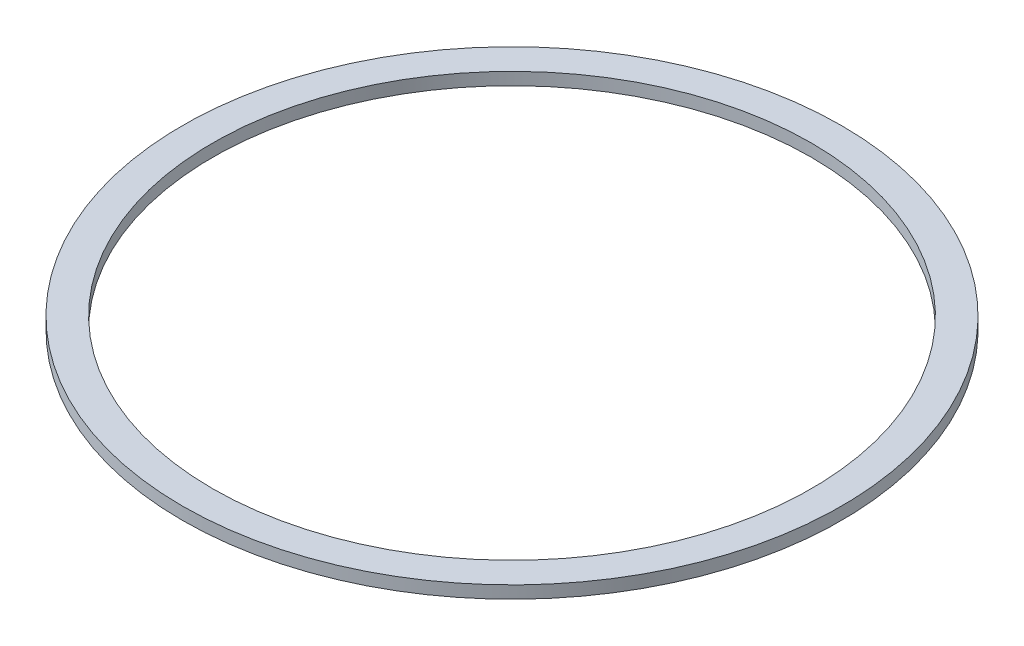
ISO-10303-21;
HEADER;
FILE_DESCRIPTION(('STEP AP214'),'2;1');
FILE_NAME('part.step','',(''),(''),'','','');
FILE_SCHEMA(('AUTOMOTIVE_DESIGN { 1 0 10303 214 1 1 1 1 }'));
ENDSEC;
DATA;
#1=APPLICATION_CONTEXT('core data for automotive mechanical design processes');
#2=APPLICATION_PROTOCOL_DEFINITION('international standard','automotive_design',2000,#1);
#3=PRODUCT_CONTEXT('',#1,'mechanical');
#4=PRODUCT('Part','Part','',(#3));
#5=PRODUCT_RELATED_PRODUCT_CATEGORY('part','',(#4));
#6=PRODUCT_DEFINITION_FORMATION('','',#4);
#7=PRODUCT_DEFINITION_CONTEXT('part definition',#1,'design');
#8=PRODUCT_DEFINITION('design','',#6,#7);
#9=PRODUCT_DEFINITION_SHAPE('','',#8);
#10=(LENGTH_UNIT() NAMED_UNIT(*) SI_UNIT(.MILLI.,.METRE.));
#11=(NAMED_UNIT(*) PLANE_ANGLE_UNIT() SI_UNIT($,.RADIAN.));
#12=(NAMED_UNIT(*) SI_UNIT($,.STERADIAN.) SOLID_ANGLE_UNIT());
#13=UNCERTAINTY_MEASURE_WITH_UNIT(LENGTH_MEASURE(1.E-05),#10,'distance_accuracy_value','');
#14=(GEOMETRIC_REPRESENTATION_CONTEXT(3) GLOBAL_UNCERTAINTY_ASSIGNED_CONTEXT((#13)) GLOBAL_UNIT_ASSIGNED_CONTEXT((#10,
#11,#12)) REPRESENTATION_CONTEXT('',''));
#15=CARTESIAN_POINT('',(0.,0.,0.));
#16=DIRECTION('',(0.,0.,1.));
#17=DIRECTION('',(1.,0.,0.));
#18=AXIS2_PLACEMENT_3D('',#15,#16,#17);
#19=CARTESIAN_POINT('',(0.,2.,0.));
#20=DIRECTION('',(0.,1.,0.));
#21=DIRECTION('',(0.,0.,1.));
#22=AXIS2_PLACEMENT_3D('',#19,#20,#21);
#23=PLANE('',#22);
#24=CARTESIAN_POINT('',(0.,2.,0.));
#25=DIRECTION('',(0.,1.,0.));
#26=DIRECTION('',(0.,0.,1.));
#27=AXIS2_PLACEMENT_3D('',#24,#25,#26);
#28=CIRCLE('',#27,53.);
#29=CARTESIAN_POINT('',(0.,2.,53.));
#30=VERTEX_POINT('',#29);
#31=EDGE_CURVE('E10',#30,#30,#28,.T.);
#32=ORIENTED_EDGE('',*,*,#31,.T.);
#33=EDGE_LOOP('',(#32));
#34=FACE_BOUND('',#33,.T.);
#35=CARTESIAN_POINT('',(0.,2.,0.));
#36=DIRECTION('',(0.,1.,0.));
#37=DIRECTION('',(0.,0.,1.));
#38=AXIS2_PLACEMENT_3D('',#35,#36,#37);
#39=CIRCLE('',#38,48.15);
#40=CARTESIAN_POINT('',(0.,2.,48.15));
#41=VERTEX_POINT('',#40);
#42=EDGE_CURVE('E50',#41,#41,#39,.T.);
#43=ORIENTED_EDGE('',*,*,#42,.F.);
#44=EDGE_LOOP('',(#43));
#45=FACE_BOUND('',#44,.T.);
#46=ADVANCED_FACE('F37',(#34,#45),#23,.T.);
#47=CARTESIAN_POINT('',(0.,0.,0.));
#48=DIRECTION('',(0.,1.,0.));
#49=DIRECTION('',(0.,0.,1.));
#50=AXIS2_PLACEMENT_3D('',#47,#48,#49);
#51=PLANE('',#50);
#52=CARTESIAN_POINT('',(0.,0.,0.));
#53=DIRECTION('',(0.,1.,0.));
#54=DIRECTION('',(0.,0.,1.));
#55=AXIS2_PLACEMENT_3D('',#52,#53,#54);
#56=CIRCLE('',#55,53.);
#57=CARTESIAN_POINT('',(0.,0.,53.));
#58=VERTEX_POINT('',#57);
#59=EDGE_CURVE('E41',#58,#58,#56,.T.);
#60=ORIENTED_EDGE('',*,*,#59,.F.);
#61=EDGE_LOOP('',(#60));
#62=FACE_BOUND('',#61,.T.);
#63=CARTESIAN_POINT('',(0.,0.,0.));
#64=DIRECTION('',(0.,1.,0.));
#65=DIRECTION('',(0.,0.,1.));
#66=AXIS2_PLACEMENT_3D('',#63,#64,#65);
#67=CIRCLE('',#66,48.15);
#68=CARTESIAN_POINT('',(0.,0.,48.15));
#69=VERTEX_POINT('',#68);
#70=EDGE_CURVE('E52',#69,#69,#67,.T.);
#71=ORIENTED_EDGE('',*,*,#70,.T.);
#72=EDGE_LOOP('',(#71));
#73=FACE_BOUND('',#72,.T.);
#74=ADVANCED_FACE('F64',(#62,#73),#51,.F.);
#75=CARTESIAN_POINT('',(0.,2.,0.));
#76=DIRECTION('',(0.,-1.,0.));
#77=DIRECTION('',(0.,0.,-1.));
#78=AXIS2_PLACEMENT_3D('',#75,#76,#77);
#79=CYLINDRICAL_SURFACE('',#78,53.);
#80=ORIENTED_EDGE('',*,*,#31,.F.);
#81=EDGE_LOOP('',(#80));
#82=FACE_BOUND('',#81,.T.);
#83=ORIENTED_EDGE('',*,*,#59,.T.);
#84=EDGE_LOOP('',(#83));
#85=FACE_BOUND('',#84,.T.);
#86=ADVANCED_FACE('F39',(#82,#85),#79,.T.);
#87=CARTESIAN_POINT('',(0.,2.,0.));
#88=DIRECTION('',(0.,-1.,0.));
#89=DIRECTION('',(0.,0.,-1.));
#90=AXIS2_PLACEMENT_3D('',#87,#88,#89);
#91=CYLINDRICAL_SURFACE('',#90,48.15);
#92=ORIENTED_EDGE('',*,*,#42,.T.);
#93=EDGE_LOOP('',(#92));
#94=FACE_BOUND('',#93,.T.);
#95=ORIENTED_EDGE('',*,*,#70,.F.);
#96=EDGE_LOOP('',(#95));
#97=FACE_BOUND('',#96,.T.);
#98=ADVANCED_FACE('F60',(#94,#97),#91,.F.);
#99=CLOSED_SHELL('',(#46,#74,#86,#98));
#100=MANIFOLD_SOLID_BREP('B2',#99);
#101=ADVANCED_BREP_SHAPE_REPRESENTATION('',(#18,#100),#14);
#102=SHAPE_DEFINITION_REPRESENTATION(#9,#101);
ENDSEC;
END-ISO-10303-21;
